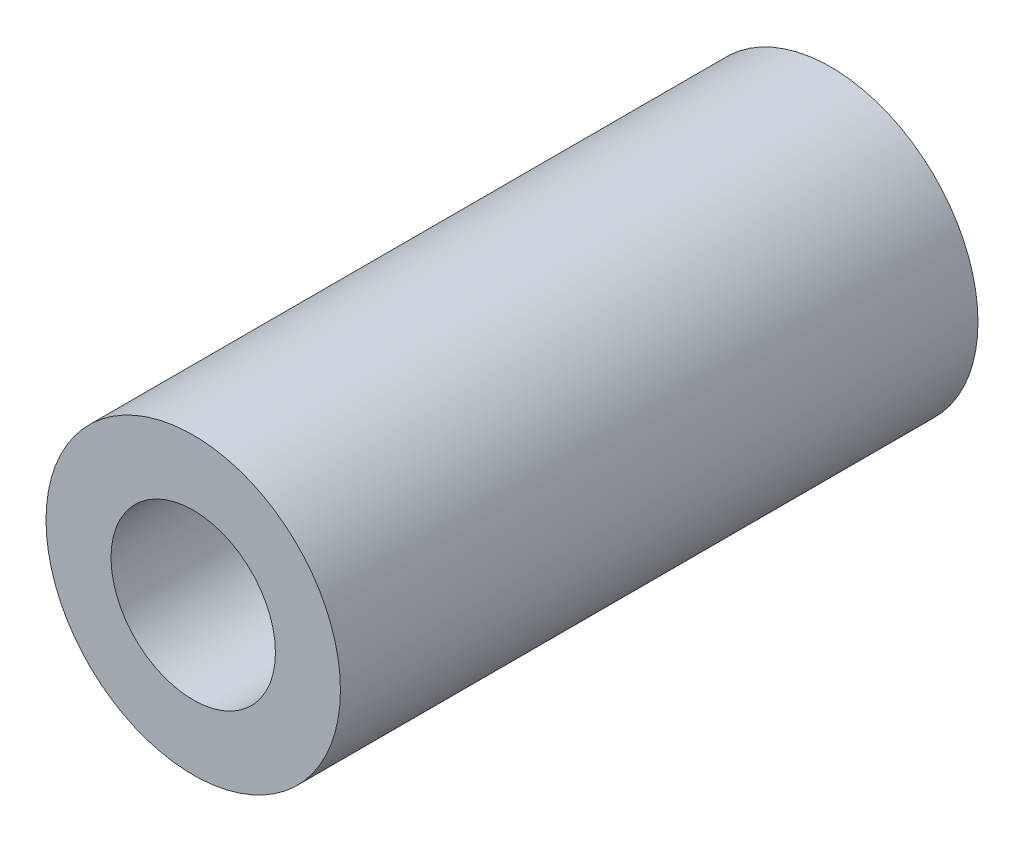
ISO-10303-21;
HEADER;
FILE_DESCRIPTION(('STEP AP214'),'2;1');
FILE_NAME('part.step','',(''),(''),'','','');
FILE_SCHEMA(('AUTOMOTIVE_DESIGN { 1 0 10303 214 1 1 1 1 }'));
ENDSEC;
DATA;
#1=APPLICATION_CONTEXT('core data for automotive mechanical design processes');
#2=APPLICATION_PROTOCOL_DEFINITION('international standard','automotive_design',2000,#1);
#3=PRODUCT_CONTEXT('',#1,'mechanical');
#4=PRODUCT('Part','Part','',(#3));
#5=PRODUCT_RELATED_PRODUCT_CATEGORY('part','',(#4));
#6=PRODUCT_DEFINITION_FORMATION('','',#4);
#7=PRODUCT_DEFINITION_CONTEXT('part definition',#1,'design');
#8=PRODUCT_DEFINITION('design','',#6,#7);
#9=PRODUCT_DEFINITION_SHAPE('','',#8);
#10=(LENGTH_UNIT() NAMED_UNIT(*) SI_UNIT(.MILLI.,.METRE.));
#11=(NAMED_UNIT(*) PLANE_ANGLE_UNIT() SI_UNIT($,.RADIAN.));
#12=(NAMED_UNIT(*) SI_UNIT($,.STERADIAN.) SOLID_ANGLE_UNIT());
#13=UNCERTAINTY_MEASURE_WITH_UNIT(LENGTH_MEASURE(1.E-05),#10,'distance_accuracy_value','');
#14=(GEOMETRIC_REPRESENTATION_CONTEXT(3) GLOBAL_UNCERTAINTY_ASSIGNED_CONTEXT((#13)) GLOBAL_UNIT_ASSIGNED_CONTEXT((#10,
#11,#12)) REPRESENTATION_CONTEXT('',''));
#15=CARTESIAN_POINT('',(0.,0.,0.));
#16=DIRECTION('',(0.,0.,1.));
#17=DIRECTION('',(1.,0.,0.));
#18=AXIS2_PLACEMENT_3D('',#15,#16,#17);
#19=CARTESIAN_POINT('',(-43.4,49.3,26.5));
#20=DIRECTION('',(0.,0.,1.));
#21=DIRECTION('',(1.,0.,0.));
#22=AXIS2_PLACEMENT_3D('',#19,#20,#21);
#23=CYLINDRICAL_SURFACE('',#22,2.15);
#24=DIRECTION('',(0.,0.,1.));
#25=VECTOR('',#24,1.);
#26=CARTESIAN_POINT('',(-41.25,49.3,26.5));
#27=LINE('',#26,#25);
#28=CARTESIAN_POINT('',(-41.25,49.3,27.));
#29=VERTEX_POINT('',#28);
#30=CARTESIAN_POINT('',(-41.25,49.3,43.672415865385));
#31=VERTEX_POINT('',#30);
#32=EDGE_CURVE('E9',#29,#31,#27,.T.);
#33=ORIENTED_EDGE('',*,*,#32,.F.);
#34=CARTESIAN_POINT('',(-43.4,49.3,27.));
#35=DIRECTION('',(0.,0.,1.));
#36=DIRECTION('',(1.,0.,0.));
#37=AXIS2_PLACEMENT_3D('',#34,#35,#36);
#38=CIRCLE('',#37,2.15);
#39=EDGE_CURVE('E24',#29,#29,#38,.T.);
#40=ORIENTED_EDGE('',*,*,#39,.F.);
#41=ORIENTED_EDGE('',*,*,#32,.T.);
#42=CARTESIAN_POINT('',(-43.4,49.3,43.672415865385));
#43=DIRECTION('',(0.,0.,1.));
#44=DIRECTION('',(1.,0.,0.));
#45=AXIS2_PLACEMENT_3D('',#42,#43,#44);
#46=CIRCLE('',#45,2.15);
#47=EDGE_CURVE('E65',#31,#31,#46,.T.);
#48=ORIENTED_EDGE('',*,*,#47,.T.);
#49=EDGE_LOOP('',(#33,#40,#41,#48));
#50=FACE_BOUND('',#49,.T.);
#51=ADVANCED_FACE('F14',(#50),#23,.F.);
#52=CARTESIAN_POINT('',(-43.4,49.3,27.));
#53=DIRECTION('',(0.,0.,1.));
#54=DIRECTION('',(1.,0.,0.));
#55=AXIS2_PLACEMENT_3D('',#52,#53,#54);
#56=PLANE('',#55);
#57=ORIENTED_EDGE('',*,*,#39,.T.);
#58=EDGE_LOOP('',(#57));
#59=FACE_BOUND('',#58,.T.);
#60=CARTESIAN_POINT('',(-43.4,49.3,27.));
#61=DIRECTION('',(0.,0.,1.));
#62=DIRECTION('',(1.,0.,0.));
#63=AXIS2_PLACEMENT_3D('',#60,#61,#62);
#64=CIRCLE('',#63,3.85);
#65=CARTESIAN_POINT('',(-39.55,49.3,27.));
#66=VERTEX_POINT('',#65);
#67=EDGE_CURVE('E47',#66,#66,#64,.T.);
#68=ORIENTED_EDGE('',*,*,#67,.F.);
#69=EDGE_LOOP('',(#68));
#70=FACE_BOUND('',#69,.T.);
#71=ADVANCED_FACE('F68',(#59,#70),#56,.F.);
#72=CARTESIAN_POINT('',(-43.4,49.3,43.672415865385));
#73=DIRECTION('',(0.,0.,1.));
#74=DIRECTION('',(1.,0.,0.));
#75=AXIS2_PLACEMENT_3D('',#72,#73,#74);
#76=PLANE('',#75);
#77=ORIENTED_EDGE('',*,*,#47,.F.);
#78=EDGE_LOOP('',(#77));
#79=FACE_BOUND('',#78,.T.);
#80=CARTESIAN_POINT('',(-43.4,49.3,43.672415865385));
#81=DIRECTION('',(0.,0.,1.));
#82=DIRECTION('',(1.,0.,0.));
#83=AXIS2_PLACEMENT_3D('',#80,#81,#82);
#84=CIRCLE('',#83,3.85);
#85=CARTESIAN_POINT('',(-39.55,49.3,43.672415865385));
#86=VERTEX_POINT('',#85);
#87=EDGE_CURVE('E17',#86,#86,#84,.T.);
#88=ORIENTED_EDGE('',*,*,#87,.T.);
#89=EDGE_LOOP('',(#88));
#90=FACE_BOUND('',#89,.T.);
#91=ADVANCED_FACE('F58',(#79,#90),#76,.T.);
#92=CARTESIAN_POINT('',(-43.4,49.3,27.));
#93=DIRECTION('',(0.,0.,1.));
#94=DIRECTION('',(1.,0.,0.));
#95=AXIS2_PLACEMENT_3D('',#92,#93,#94);
#96=CYLINDRICAL_SURFACE('',#95,3.85);
#97=ORIENTED_EDGE('',*,*,#87,.F.);
#98=DIRECTION('',(0.,0.,1.));
#99=VECTOR('',#98,1.);
#100=CARTESIAN_POINT('',(-39.55,49.3,27.));
#101=LINE('',#100,#99);
#102=EDGE_CURVE('E52',#66,#86,#101,.T.);
#103=ORIENTED_EDGE('',*,*,#102,.F.);
#104=ORIENTED_EDGE('',*,*,#67,.T.);
#105=ORIENTED_EDGE('',*,*,#102,.T.);
#106=EDGE_LOOP('',(#97,#103,#104,#105));
#107=FACE_BOUND('',#106,.T.);
#108=ADVANCED_FACE('F54',(#107),#96,.T.);
#109=CLOSED_SHELL('',(#51,#71,#91,#108));
#110=MANIFOLD_SOLID_BREP('B1',#109);
#111=ADVANCED_BREP_SHAPE_REPRESENTATION('',(#18,#110),#14);
#112=SHAPE_DEFINITION_REPRESENTATION(#9,#111);
ENDSEC;
END-ISO-10303-21;
